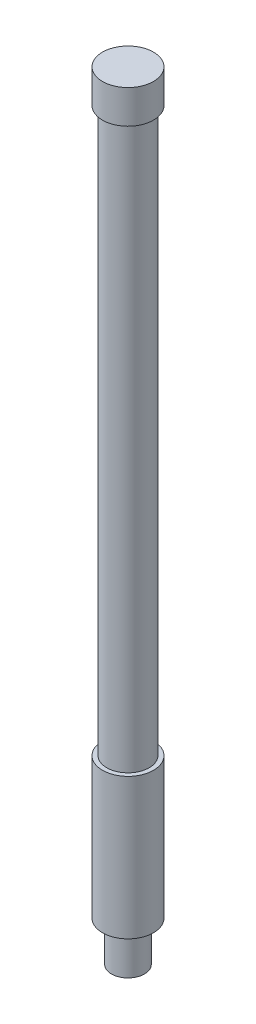
ISO-10303-21;
HEADER;
FILE_DESCRIPTION(('STEP AP214'),'2;1');
FILE_NAME('part.step','',(''),(''),'','','');
FILE_SCHEMA(('AUTOMOTIVE_DESIGN { 1 0 10303 214 1 1 1 1 }'));
ENDSEC;
DATA;
#1=APPLICATION_CONTEXT('core data for automotive mechanical design processes');
#2=APPLICATION_PROTOCOL_DEFINITION('international standard','automotive_design',2000,#1);
#3=PRODUCT_CONTEXT('',#1,'mechanical');
#4=PRODUCT('Part','Part','',(#3));
#5=PRODUCT_RELATED_PRODUCT_CATEGORY('part','',(#4));
#6=PRODUCT_DEFINITION_FORMATION('','',#4);
#7=PRODUCT_DEFINITION_CONTEXT('part definition',#1,'design');
#8=PRODUCT_DEFINITION('design','',#6,#7);
#9=PRODUCT_DEFINITION_SHAPE('','',#8);
#10=(LENGTH_UNIT() NAMED_UNIT(*) SI_UNIT(.MILLI.,.METRE.));
#11=(NAMED_UNIT(*) PLANE_ANGLE_UNIT() SI_UNIT($,.RADIAN.));
#12=(NAMED_UNIT(*) SI_UNIT($,.STERADIAN.) SOLID_ANGLE_UNIT());
#13=UNCERTAINTY_MEASURE_WITH_UNIT(LENGTH_MEASURE(1.E-05),#10,'distance_accuracy_value','');
#14=(GEOMETRIC_REPRESENTATION_CONTEXT(3) GLOBAL_UNCERTAINTY_ASSIGNED_CONTEXT((#13)) GLOBAL_UNIT_ASSIGNED_CONTEXT((#10,
#11,#12)) REPRESENTATION_CONTEXT('',''));
#15=CARTESIAN_POINT('',(0.,0.,0.));
#16=DIRECTION('',(0.,0.,1.));
#17=DIRECTION('',(1.,0.,0.));
#18=AXIS2_PLACEMENT_3D('',#15,#16,#17);
#19=CARTESIAN_POINT('',(0.,-19.05,0.));
#20=DIRECTION('',(0.,1.,0.));
#21=DIRECTION('',(-1.,0.,0.));
#22=AXIS2_PLACEMENT_3D('',#19,#20,#21);
#23=PLANE('',#22);
#24=CARTESIAN_POINT('',(0.,-19.05,0.));
#25=DIRECTION('',(0.,1.,0.));
#26=DIRECTION('',(-1.,0.,0.));
#27=AXIS2_PLACEMENT_3D('',#24,#25,#26);
#28=CIRCLE('',#27,7.8105);
#29=CARTESIAN_POINT('',(-7.8105,-19.05,0.));
#30=VERTEX_POINT('',#29);
#31=EDGE_CURVE('E10',#30,#30,#28,.T.);
#32=ORIENTED_EDGE('',*,*,#31,.F.);
#33=EDGE_LOOP('',(#32));
#34=FACE_BOUND('',#33,.T.);
#35=ADVANCED_FACE('F31',(#34),#23,.F.);
#36=CARTESIAN_POINT('',(0.,349.25,0.));
#37=DIRECTION('',(0.,1.,0.));
#38=DIRECTION('',(-1.,0.,0.));
#39=AXIS2_PLACEMENT_3D('',#36,#37,#38);
#40=CYLINDRICAL_SURFACE('',#39,7.81050000000001);
#41=CARTESIAN_POINT('',(0.,0.,0.));
#42=DIRECTION('',(0.,1.,0.));
#43=DIRECTION('',(-1.,0.,0.));
#44=AXIS2_PLACEMENT_3D('',#41,#42,#43);
#45=CIRCLE('',#44,7.81050000000001);
#46=CARTESIAN_POINT('',(-7.81050000000001,0.,0.));
#47=VERTEX_POINT('',#46);
#48=EDGE_CURVE('E37',#47,#47,#45,.T.);
#49=ORIENTED_EDGE('',*,*,#48,.F.);
#50=EDGE_LOOP('',(#49));
#51=FACE_BOUND('',#50,.T.);
#52=ORIENTED_EDGE('',*,*,#31,.T.);
#53=EDGE_LOOP('',(#52));
#54=FACE_BOUND('',#53,.T.);
#55=ADVANCED_FACE('F97',(#51,#54),#40,.T.);
#56=CARTESIAN_POINT('',(7.81050000000001,0.,0.));
#57=DIRECTION('',(0.,1.,0.));
#58=DIRECTION('',(-1.,0.,0.));
#59=AXIS2_PLACEMENT_3D('',#56,#57,#58);
#60=PLANE('',#59);
#61=CARTESIAN_POINT('',(0.,0.,0.));
#62=DIRECTION('',(0.,1.,0.));
#63=DIRECTION('',(-1.,0.,0.));
#64=AXIS2_PLACEMENT_3D('',#61,#62,#63);
#65=CIRCLE('',#64,12.065);
#66=CARTESIAN_POINT('',(-12.065,0.,0.));
#67=VERTEX_POINT('',#66);
#68=EDGE_CURVE('E41',#67,#67,#65,.T.);
#69=ORIENTED_EDGE('',*,*,#68,.F.);
#70=EDGE_LOOP('',(#69));
#71=FACE_BOUND('',#70,.T.);
#72=ORIENTED_EDGE('',*,*,#48,.T.);
#73=EDGE_LOOP('',(#72));
#74=FACE_BOUND('',#73,.T.);
#75=ADVANCED_FACE('F92',(#71,#74),#60,.F.);
#76=CARTESIAN_POINT('',(0.,349.25,0.));
#77=DIRECTION('',(0.,1.,0.));
#78=DIRECTION('',(-1.,0.,0.));
#79=AXIS2_PLACEMENT_3D('',#76,#77,#78);
#80=CYLINDRICAL_SURFACE('',#79,12.065);
#81=CARTESIAN_POINT('',(0.,66.675,0.));
#82=DIRECTION('',(0.,1.,0.));
#83=DIRECTION('',(-1.,0.,0.));
#84=AXIS2_PLACEMENT_3D('',#81,#82,#83);
#85=CIRCLE('',#84,12.065);
#86=CARTESIAN_POINT('',(-12.065,66.675,0.));
#87=VERTEX_POINT('',#86);
#88=EDGE_CURVE('E45',#87,#87,#85,.T.);
#89=ORIENTED_EDGE('',*,*,#88,.F.);
#90=EDGE_LOOP('',(#89));
#91=FACE_BOUND('',#90,.T.);
#92=ORIENTED_EDGE('',*,*,#68,.T.);
#93=EDGE_LOOP('',(#92));
#94=FACE_BOUND('',#93,.T.);
#95=ADVANCED_FACE('F86',(#91,#94),#80,.T.);
#96=CARTESIAN_POINT('',(12.065,66.675,0.));
#97=DIRECTION('',(0.,-1.,0.));
#98=DIRECTION('',(1.,0.,0.));
#99=AXIS2_PLACEMENT_3D('',#96,#97,#98);
#100=PLANE('',#99);
#101=CARTESIAN_POINT('',(0.,66.675,0.));
#102=DIRECTION('',(0.,1.,0.));
#103=DIRECTION('',(-1.,0.,0.));
#104=AXIS2_PLACEMENT_3D('',#101,#102,#103);
#105=CIRCLE('',#104,10.033);
#106=CARTESIAN_POINT('',(-10.033,66.675,0.));
#107=VERTEX_POINT('',#106);
#108=EDGE_CURVE('E50',#107,#107,#105,.T.);
#109=ORIENTED_EDGE('',*,*,#108,.F.);
#110=EDGE_LOOP('',(#109));
#111=FACE_BOUND('',#110,.T.);
#112=ORIENTED_EDGE('',*,*,#88,.T.);
#113=EDGE_LOOP('',(#112));
#114=FACE_BOUND('',#113,.T.);
#115=ADVANCED_FACE('F80',(#111,#114),#100,.F.);
#116=CARTESIAN_POINT('',(0.,349.25,0.));
#117=DIRECTION('',(0.,1.,0.));
#118=DIRECTION('',(-1.,0.,0.));
#119=AXIS2_PLACEMENT_3D('',#116,#117,#118);
#120=CYLINDRICAL_SURFACE('',#119,10.033);
#121=CARTESIAN_POINT('',(0.,333.375,0.));
#122=DIRECTION('',(0.,1.,0.));
#123=DIRECTION('',(-1.,0.,0.));
#124=AXIS2_PLACEMENT_3D('',#121,#122,#123);
#125=CIRCLE('',#124,10.033);
#126=CARTESIAN_POINT('',(-10.0330000000001,333.375,0.));
#127=VERTEX_POINT('',#126);
#128=EDGE_CURVE('E53',#127,#127,#125,.T.);
#129=ORIENTED_EDGE('',*,*,#128,.F.);
#130=EDGE_LOOP('',(#129));
#131=FACE_BOUND('',#130,.T.);
#132=ORIENTED_EDGE('',*,*,#108,.T.);
#133=EDGE_LOOP('',(#132));
#134=FACE_BOUND('',#133,.T.);
#135=ADVANCED_FACE('F74',(#131,#134),#120,.T.);
#136=CARTESIAN_POINT('',(10.033,333.375,0.));
#137=DIRECTION('',(0.,1.,0.));
#138=DIRECTION('',(-1.,0.,0.));
#139=AXIS2_PLACEMENT_3D('',#136,#137,#138);
#140=PLANE('',#139);
#141=CARTESIAN_POINT('',(0.,333.375,0.));
#142=DIRECTION('',(0.,1.,0.));
#143=DIRECTION('',(-1.,0.,0.));
#144=AXIS2_PLACEMENT_3D('',#141,#142,#143);
#145=CIRCLE('',#144,12.065);
#146=CARTESIAN_POINT('',(-12.0650000000001,333.375,0.));
#147=VERTEX_POINT('',#146);
#148=EDGE_CURVE('E56',#147,#147,#145,.T.);
#149=ORIENTED_EDGE('',*,*,#148,.F.);
#150=EDGE_LOOP('',(#149));
#151=FACE_BOUND('',#150,.T.);
#152=ORIENTED_EDGE('',*,*,#128,.T.);
#153=EDGE_LOOP('',(#152));
#154=FACE_BOUND('',#153,.T.);
#155=ADVANCED_FACE('F68',(#151,#154),#140,.F.);
#156=CARTESIAN_POINT('',(0.,349.25,0.));
#157=DIRECTION('',(0.,1.,0.));
#158=DIRECTION('',(-1.,0.,0.));
#159=AXIS2_PLACEMENT_3D('',#156,#157,#158);
#160=CYLINDRICAL_SURFACE('',#159,12.065);
#161=CARTESIAN_POINT('',(0.,349.25,0.));
#162=DIRECTION('',(0.,1.,0.));
#163=DIRECTION('',(-1.,0.,0.));
#164=AXIS2_PLACEMENT_3D('',#161,#162,#163);
#165=CIRCLE('',#164,12.065);
#166=CARTESIAN_POINT('',(-12.0650000000001,349.25,0.));
#167=VERTEX_POINT('',#166);
#168=EDGE_CURVE('E59',#167,#167,#165,.T.);
#169=ORIENTED_EDGE('',*,*,#168,.F.);
#170=EDGE_LOOP('',(#169));
#171=FACE_BOUND('',#170,.T.);
#172=ORIENTED_EDGE('',*,*,#148,.T.);
#173=EDGE_LOOP('',(#172));
#174=FACE_BOUND('',#173,.T.);
#175=ADVANCED_FACE('F65',(#171,#174),#160,.T.);
#176=CARTESIAN_POINT('',(12.065,349.25,0.));
#177=DIRECTION('',(0.,-1.,0.));
#178=DIRECTION('',(1.,0.,0.));
#179=AXIS2_PLACEMENT_3D('',#176,#177,#178);
#180=PLANE('',#179);
#181=ORIENTED_EDGE('',*,*,#168,.T.);
#182=EDGE_LOOP('',(#181));
#183=FACE_BOUND('',#182,.T.);
#184=ADVANCED_FACE('F63',(#183),#180,.F.);
#185=CLOSED_SHELL('',(#35,#55,#75,#95,#115,#135,#155,#175,#184));
#186=MANIFOLD_SOLID_BREP('B2',#185);
#187=ADVANCED_BREP_SHAPE_REPRESENTATION('',(#18,#186),#14);
#188=SHAPE_DEFINITION_REPRESENTATION(#9,#187);
ENDSEC;
END-ISO-10303-21;
